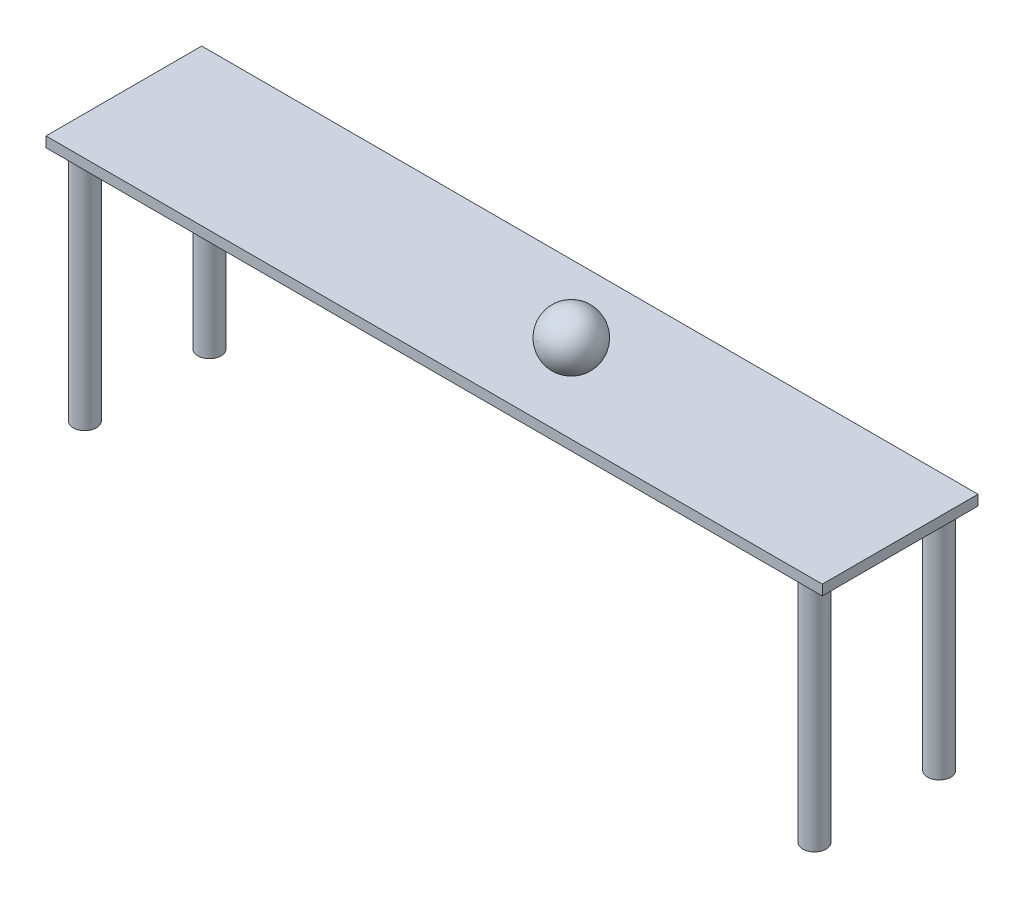
ISO-10303-21;
HEADER;
FILE_DESCRIPTION(('STEP AP214'),'2;1');
FILE_NAME('part.step','',(''),(''),'','','');
FILE_SCHEMA(('AUTOMOTIVE_DESIGN { 1 0 10303 214 1 1 1 1 }'));
ENDSEC;
DATA;
#1=APPLICATION_CONTEXT('core data for automotive mechanical design processes');
#2=APPLICATION_PROTOCOL_DEFINITION('international standard','automotive_design',2000,#1);
#3=PRODUCT_CONTEXT('',#1,'mechanical');
#4=PRODUCT('Part','Part','',(#3));
#5=PRODUCT_RELATED_PRODUCT_CATEGORY('part','',(#4));
#6=PRODUCT_DEFINITION_FORMATION('','',#4);
#7=PRODUCT_DEFINITION_CONTEXT('part definition',#1,'design');
#8=PRODUCT_DEFINITION('design','',#6,#7);
#9=PRODUCT_DEFINITION_SHAPE('','',#8);
#10=(LENGTH_UNIT() NAMED_UNIT(*) SI_UNIT(.MILLI.,.METRE.));
#11=(NAMED_UNIT(*) PLANE_ANGLE_UNIT() SI_UNIT($,.RADIAN.));
#12=(NAMED_UNIT(*) SI_UNIT($,.STERADIAN.) SOLID_ANGLE_UNIT());
#13=UNCERTAINTY_MEASURE_WITH_UNIT(LENGTH_MEASURE(1.E-05),#10,'distance_accuracy_value','');
#14=(GEOMETRIC_REPRESENTATION_CONTEXT(3) GLOBAL_UNCERTAINTY_ASSIGNED_CONTEXT((#13)) GLOBAL_UNIT_ASSIGNED_CONTEXT((#10,
#11,#12)) REPRESENTATION_CONTEXT('',''));
#15=CARTESIAN_POINT('',(0.,0.,0.));
#16=DIRECTION('',(0.,0.,1.));
#17=DIRECTION('',(1.,0.,0.));
#18=AXIS2_PLACEMENT_3D('',#15,#16,#17);
#19=CARTESIAN_POINT('',(100.,497.681146786366,176.992255331555));
#20=DIRECTION('',(0.,1.,0.));
#21=DIRECTION('',(0.,0.,1.));
#22=AXIS2_PLACEMENT_3D('',#19,#20,#21);
#23=SPHERICAL_SURFACE('',#22,35.);
#24=CARTESIAN_POINT('',(100.,532.681146786366,176.992255331555));
#25=VERTEX_POINT('',#24);
#26=VERTEX_LOOP('',#25);
#27=FACE_BOUND('',#26,.T.);
#28=ADVANCED_FACE('F37',(#27),#23,.T.);
#29=CLOSED_SHELL('',(#28));
#30=MANIFOLD_SOLID_BREP('B2',#29);
#31=CARTESIAN_POINT('',(500.,447.99621716114,253.640443622216));
#32=DIRECTION('',(0.,1.,0.));
#33=DIRECTION('',(0.,0.,1.));
#34=AXIS2_PLACEMENT_3D('',#31,#32,#33);
#35=PLANE('',#34);
#36=CARTESIAN_POINT('',(470.,447.99621716114,73.0579335827263));
#37=DIRECTION('',(0.,1.,0.));
#38=DIRECTION('',(0.,0.,1.));
#39=AXIS2_PLACEMENT_3D('',#36,#37,#38);
#40=CIRCLE('',#39,15.);
#41=CARTESIAN_POINT('',(470.,447.99621716114,88.0579335827264));
#42=VERTEX_POINT('',#41);
#43=EDGE_CURVE('E58',#42,#42,#40,.F.);
#44=ORIENTED_EDGE('',*,*,#43,.F.);
#45=EDGE_LOOP('',(#44));
#46=FACE_BOUND('',#45,.T.);
#47=CARTESIAN_POINT('',(-470.,447.99621716114,233.640443622216));
#48=DIRECTION('',(0.,1.,0.));
#49=DIRECTION('',(0.,0.,1.));
#50=AXIS2_PLACEMENT_3D('',#47,#48,#49);
#51=CIRCLE('',#50,15.);
#52=CARTESIAN_POINT('',(-470.,447.99621716114,248.640443622216));
#53=VERTEX_POINT('',#52);
#54=EDGE_CURVE('E108',#53,#53,#51,.F.);
#55=ORIENTED_EDGE('',*,*,#54,.F.);
#56=EDGE_LOOP('',(#55));
#57=FACE_BOUND('',#56,.T.);
#58=DIRECTION('',(0.,0.,-1.));
#59=VECTOR('',#58,1.);
#60=CARTESIAN_POINT('',(-500.,447.99621716114,253.640443622216));
#61=LINE('',#60,#59);
#62=CARTESIAN_POINT('',(-500.,447.99621716114,253.640443622216));
#63=VERTEX_POINT('',#62);
#64=CARTESIAN_POINT('',(-500.,447.99621716114,53.0579335827263));
#65=VERTEX_POINT('',#64);
#66=EDGE_CURVE('E91',#63,#65,#61,.T.);
#67=ORIENTED_EDGE('',*,*,#66,.T.);
#68=DIRECTION('',(-1.,0.,0.));
#69=VECTOR('',#68,1.);
#70=CARTESIAN_POINT('',(500.,447.99621716114,53.0579335827263));
#71=LINE('',#70,#69);
#72=CARTESIAN_POINT('',(500.,447.99621716114,53.0579335827263));
#73=VERTEX_POINT('',#72);
#74=EDGE_CURVE('E109',#73,#65,#71,.T.);
#75=ORIENTED_EDGE('',*,*,#74,.F.);
#76=DIRECTION('',(0.,0.,-1.));
#77=VECTOR('',#76,1.);
#78=CARTESIAN_POINT('',(500.,447.99621716114,253.640443622216));
#79=LINE('',#78,#77);
#80=CARTESIAN_POINT('',(500.,447.99621716114,253.640443622216));
#81=VERTEX_POINT('',#80);
#82=EDGE_CURVE('E105',#81,#73,#79,.T.);
#83=ORIENTED_EDGE('',*,*,#82,.F.);
#84=DIRECTION('',(-1.,0.,0.));
#85=VECTOR('',#84,1.);
#86=CARTESIAN_POINT('',(500.,447.99621716114,253.640443622216));
#87=LINE('',#86,#85);
#88=EDGE_CURVE('E103',#81,#63,#87,.T.);
#89=ORIENTED_EDGE('',*,*,#88,.T.);
#90=EDGE_LOOP('',(#67,#75,#83,#89));
#91=FACE_BOUND('',#90,.T.);
#92=CARTESIAN_POINT('',(-470.,447.99621716114,73.0579335827263));
#93=DIRECTION('',(0.,1.,0.));
#94=DIRECTION('',(0.,0.,1.));
#95=AXIS2_PLACEMENT_3D('',#92,#93,#94);
#96=CIRCLE('',#95,15.);
#97=CARTESIAN_POINT('',(-470.,447.99621716114,88.0579335827264));
#98=VERTEX_POINT('',#97);
#99=EDGE_CURVE('E135',#98,#98,#96,.F.);
#100=ORIENTED_EDGE('',*,*,#99,.F.);
#101=EDGE_LOOP('',(#100));
#102=FACE_BOUND('',#101,.T.);
#103=CARTESIAN_POINT('',(470.,447.99621716114,233.640443622216));
#104=DIRECTION('',(0.,1.,0.));
#105=DIRECTION('',(0.,0.,1.));
#106=AXIS2_PLACEMENT_3D('',#103,#104,#105);
#107=CIRCLE('',#106,15.);
#108=CARTESIAN_POINT('',(470.,447.99621716114,248.640443622216));
#109=VERTEX_POINT('',#108);
#110=EDGE_CURVE('E35',#109,#109,#107,.F.);
#111=ORIENTED_EDGE('',*,*,#110,.F.);
#112=EDGE_LOOP('',(#111));
#113=FACE_BOUND('',#112,.T.);
#114=ADVANCED_FACE('F50',(#46,#57,#91,#102,#113),#35,.F.);
#115=CARTESIAN_POINT('',(500.,461.204560088703,253.640443622216));
#116=DIRECTION('',(0.,0.,-1.));
#117=DIRECTION('',(-1.,0.,0.));
#118=AXIS2_PLACEMENT_3D('',#115,#116,#117);
#119=PLANE('',#118);
#120=DIRECTION('',(0.,-1.,0.));
#121=VECTOR('',#120,1.);
#122=CARTESIAN_POINT('',(-500.,461.204560088703,253.640443622216));
#123=LINE('',#122,#121);
#124=CARTESIAN_POINT('',(-500.,461.204560088703,253.640443622216));
#125=VERTEX_POINT('',#124);
#126=EDGE_CURVE('E96',#125,#63,#123,.T.);
#127=ORIENTED_EDGE('',*,*,#126,.T.);
#128=ORIENTED_EDGE('',*,*,#88,.F.);
#129=DIRECTION('',(0.,-1.,0.));
#130=VECTOR('',#129,1.);
#131=CARTESIAN_POINT('',(500.,461.204560088703,253.640443622216));
#132=LINE('',#131,#130);
#133=CARTESIAN_POINT('',(500.,461.204560088703,253.640443622216));
#134=VERTEX_POINT('',#133);
#135=EDGE_CURVE('E123',#134,#81,#132,.T.);
#136=ORIENTED_EDGE('',*,*,#135,.F.);
#137=DIRECTION('',(-1.,0.,0.));
#138=VECTOR('',#137,1.);
#139=CARTESIAN_POINT('',(500.,461.204560088703,253.640443622216));
#140=LINE('',#139,#138);
#141=EDGE_CURVE('E112',#134,#125,#140,.T.);
#142=ORIENTED_EDGE('',*,*,#141,.T.);
#143=EDGE_LOOP('',(#127,#128,#136,#142));
#144=FACE_BOUND('',#143,.T.);
#145=ADVANCED_FACE('F52',(#144),#119,.F.);
#146=CARTESIAN_POINT('',(500.,461.204560088703,53.0579335827263));
#147=DIRECTION('',(0.,0.,1.));
#148=DIRECTION('',(1.,0.,0.));
#149=AXIS2_PLACEMENT_3D('',#146,#147,#148);
#150=PLANE('',#149);
#151=DIRECTION('',(0.,1.,0.));
#152=VECTOR('',#151,1.);
#153=CARTESIAN_POINT('',(-500.,461.204560088703,53.0579335827263));
#154=LINE('',#153,#152);
#155=CARTESIAN_POINT('',(-500.,461.204560088703,53.0579335827263));
#156=VERTEX_POINT('',#155);
#157=EDGE_CURVE('E97',#65,#156,#154,.T.);
#158=ORIENTED_EDGE('',*,*,#157,.T.);
#159=DIRECTION('',(-1.,0.,0.));
#160=VECTOR('',#159,1.);
#161=CARTESIAN_POINT('',(500.,461.204560088703,53.0579335827263));
#162=LINE('',#161,#160);
#163=CARTESIAN_POINT('',(500.,461.204560088703,53.0579335827263));
#164=VERTEX_POINT('',#163);
#165=EDGE_CURVE('E129',#164,#156,#162,.T.);
#166=ORIENTED_EDGE('',*,*,#165,.F.);
#167=DIRECTION('',(0.,1.,0.));
#168=VECTOR('',#167,1.);
#169=CARTESIAN_POINT('',(500.,461.204560088703,53.0579335827263));
#170=LINE('',#169,#168);
#171=EDGE_CURVE('E70',#73,#164,#170,.T.);
#172=ORIENTED_EDGE('',*,*,#171,.F.);
#173=ORIENTED_EDGE('',*,*,#74,.T.);
#174=EDGE_LOOP('',(#158,#166,#172,#173));
#175=FACE_BOUND('',#174,.T.);
#176=ADVANCED_FACE('F168',(#175),#150,.F.);
#177=CARTESIAN_POINT('',(500.,461.204560088703,253.640443622216));
#178=DIRECTION('',(0.,-1.,0.));
#179=DIRECTION('',(0.,0.,-1.));
#180=AXIS2_PLACEMENT_3D('',#177,#178,#179);
#181=PLANE('',#180);
#182=DIRECTION('',(0.,0.,1.));
#183=VECTOR('',#182,1.);
#184=CARTESIAN_POINT('',(-500.,461.204560088703,253.640443622216));
#185=LINE('',#184,#183);
#186=EDGE_CURVE('E121',#156,#125,#185,.T.);
#187=ORIENTED_EDGE('',*,*,#186,.T.);
#188=ORIENTED_EDGE('',*,*,#141,.F.);
#189=DIRECTION('',(0.,0.,1.));
#190=VECTOR('',#189,1.);
#191=CARTESIAN_POINT('',(500.,461.204560088703,253.640443622216));
#192=LINE('',#191,#190);
#193=EDGE_CURVE('E65',#164,#134,#192,.T.);
#194=ORIENTED_EDGE('',*,*,#193,.F.);
#195=ORIENTED_EDGE('',*,*,#165,.T.);
#196=EDGE_LOOP('',(#187,#188,#194,#195));
#197=FACE_BOUND('',#196,.T.);
#198=ADVANCED_FACE('F165',(#197),#181,.F.);
#199=CARTESIAN_POINT('',(500.,447.99621716114,253.640443622216));
#200=DIRECTION('',(1.,0.,0.));
#201=DIRECTION('',(0.,0.,-1.));
#202=AXIS2_PLACEMENT_3D('',#199,#200,#201);
#203=PLANE('',#202);
#204=ORIENTED_EDGE('',*,*,#135,.T.);
#205=ORIENTED_EDGE('',*,*,#82,.T.);
#206=ORIENTED_EDGE('',*,*,#171,.T.);
#207=ORIENTED_EDGE('',*,*,#193,.T.);
#208=EDGE_LOOP('',(#204,#205,#206,#207));
#209=FACE_BOUND('',#208,.T.);
#210=ADVANCED_FACE('F158',(#209),#203,.T.);
#211=CARTESIAN_POINT('',(-500.,447.99621716114,253.640443622216));
#212=DIRECTION('',(1.,0.,0.));
#213=DIRECTION('',(0.,0.,-1.));
#214=AXIS2_PLACEMENT_3D('',#211,#212,#213);
#215=PLANE('',#214);
#216=ORIENTED_EDGE('',*,*,#126,.F.);
#217=ORIENTED_EDGE('',*,*,#186,.F.);
#218=ORIENTED_EDGE('',*,*,#157,.F.);
#219=ORIENTED_EDGE('',*,*,#66,.F.);
#220=EDGE_LOOP('',(#216,#217,#218,#219));
#221=FACE_BOUND('',#220,.T.);
#222=ADVANCED_FACE('F93',(#221),#215,.F.);
#223=CARTESIAN_POINT('',(-470.,147.99621716114,233.640443622216));
#224=DIRECTION('',(0.,1.,0.));
#225=DIRECTION('',(0.,0.,1.));
#226=AXIS2_PLACEMENT_3D('',#223,#224,#225);
#227=CYLINDRICAL_SURFACE('',#226,15.);
#228=CARTESIAN_POINT('',(-470.,147.99621716114,233.640443622216));
#229=DIRECTION('',(0.,-1.,0.));
#230=DIRECTION('',(0.,0.,-1.));
#231=AXIS2_PLACEMENT_3D('',#228,#229,#230);
#232=CIRCLE('',#231,15.);
#233=CARTESIAN_POINT('',(-470.,147.99621716114,218.640443622216));
#234=VERTEX_POINT('',#233);
#235=EDGE_CURVE('E113',#234,#234,#232,.T.);
#236=ORIENTED_EDGE('',*,*,#235,.F.);
#237=EDGE_LOOP('',(#236));
#238=FACE_BOUND('',#237,.T.);
#239=ORIENTED_EDGE('',*,*,#54,.T.);
#240=EDGE_LOOP('',(#239));
#241=FACE_BOUND('',#240,.T.);
#242=ADVANCED_FACE('F146',(#238,#241),#227,.T.);
#243=CARTESIAN_POINT('',(-470.,147.99621716114,233.640443622216));
#244=DIRECTION('',(0.,-1.,0.));
#245=DIRECTION('',(0.,0.,-1.));
#246=AXIS2_PLACEMENT_3D('',#243,#244,#245);
#247=PLANE('',#246);
#248=ORIENTED_EDGE('',*,*,#235,.T.);
#249=EDGE_LOOP('',(#248));
#250=FACE_BOUND('',#249,.T.);
#251=ADVANCED_FACE('F148',(#250),#247,.T.);
#252=CARTESIAN_POINT('',(-470.,147.99621716114,73.0579335827263));
#253=DIRECTION('',(0.,1.,0.));
#254=DIRECTION('',(0.,0.,1.));
#255=AXIS2_PLACEMENT_3D('',#252,#253,#254);
#256=CYLINDRICAL_SURFACE('',#255,15.);
#257=CARTESIAN_POINT('',(-470.,147.99621716114,73.0579335827263));
#258=DIRECTION('',(0.,-1.,0.));
#259=DIRECTION('',(0.,0.,-1.));
#260=AXIS2_PLACEMENT_3D('',#257,#258,#259);
#261=CIRCLE('',#260,15.);
#262=CARTESIAN_POINT('',(-470.,147.99621716114,58.0579335827263));
#263=VERTEX_POINT('',#262);
#264=EDGE_CURVE('E116',#263,#263,#261,.T.);
#265=ORIENTED_EDGE('',*,*,#264,.F.);
#266=EDGE_LOOP('',(#265));
#267=FACE_BOUND('',#266,.T.);
#268=ORIENTED_EDGE('',*,*,#99,.T.);
#269=EDGE_LOOP('',(#268));
#270=FACE_BOUND('',#269,.T.);
#271=ADVANCED_FACE('F155',(#267,#270),#256,.T.);
#272=CARTESIAN_POINT('',(-470.,147.99621716114,73.0579335827263));
#273=DIRECTION('',(0.,-1.,0.));
#274=DIRECTION('',(0.,0.,-1.));
#275=AXIS2_PLACEMENT_3D('',#272,#273,#274);
#276=PLANE('',#275);
#277=ORIENTED_EDGE('',*,*,#264,.T.);
#278=EDGE_LOOP('',(#277));
#279=FACE_BOUND('',#278,.T.);
#280=ADVANCED_FACE('F204',(#279),#276,.T.);
#281=CARTESIAN_POINT('',(470.,147.99621716114,73.0579335827263));
#282=DIRECTION('',(0.,1.,0.));
#283=DIRECTION('',(0.,0.,1.));
#284=AXIS2_PLACEMENT_3D('',#281,#282,#283);
#285=CYLINDRICAL_SURFACE('',#284,15.);
#286=CARTESIAN_POINT('',(470.,147.99621716114,73.0579335827263));
#287=DIRECTION('',(0.,-1.,0.));
#288=DIRECTION('',(0.,0.,-1.));
#289=AXIS2_PLACEMENT_3D('',#286,#287,#288);
#290=CIRCLE('',#289,15.);
#291=CARTESIAN_POINT('',(470.,147.99621716114,58.0579335827263));
#292=VERTEX_POINT('',#291);
#293=EDGE_CURVE('E259',#292,#292,#290,.T.);
#294=ORIENTED_EDGE('',*,*,#293,.F.);
#295=EDGE_LOOP('',(#294));
#296=FACE_BOUND('',#295,.T.);
#297=ORIENTED_EDGE('',*,*,#43,.T.);
#298=EDGE_LOOP('',(#297));
#299=FACE_BOUND('',#298,.T.);
#300=ADVANCED_FACE('F140',(#296,#299),#285,.T.);
#301=CARTESIAN_POINT('',(470.,147.99621716114,73.0579335827263));
#302=DIRECTION('',(0.,-1.,0.));
#303=DIRECTION('',(0.,0.,-1.));
#304=AXIS2_PLACEMENT_3D('',#301,#302,#303);
#305=PLANE('',#304);
#306=ORIENTED_EDGE('',*,*,#293,.T.);
#307=EDGE_LOOP('',(#306));
#308=FACE_BOUND('',#307,.T.);
#309=ADVANCED_FACE('F222',(#308),#305,.T.);
#310=CARTESIAN_POINT('',(470.,147.99621716114,233.640443622216));
#311=DIRECTION('',(0.,1.,0.));
#312=DIRECTION('',(0.,0.,1.));
#313=AXIS2_PLACEMENT_3D('',#310,#311,#312);
#314=CYLINDRICAL_SURFACE('',#313,15.);
#315=CARTESIAN_POINT('',(470.,147.99621716114,233.640443622216));
#316=DIRECTION('',(0.,-1.,0.));
#317=DIRECTION('',(0.,0.,-1.));
#318=AXIS2_PLACEMENT_3D('',#315,#316,#317);
#319=CIRCLE('',#318,15.);
#320=CARTESIAN_POINT('',(470.,147.99621716114,218.640443622216));
#321=VERTEX_POINT('',#320);
#322=EDGE_CURVE('E258',#321,#321,#319,.T.);
#323=ORIENTED_EDGE('',*,*,#322,.F.);
#324=EDGE_LOOP('',(#323));
#325=FACE_BOUND('',#324,.T.);
#326=ORIENTED_EDGE('',*,*,#110,.T.);
#327=EDGE_LOOP('',(#326));
#328=FACE_BOUND('',#327,.T.);
#329=ADVANCED_FACE('F232',(#325,#328),#314,.T.);
#330=CARTESIAN_POINT('',(470.,147.99621716114,233.640443622216));
#331=DIRECTION('',(0.,-1.,0.));
#332=DIRECTION('',(0.,0.,-1.));
#333=AXIS2_PLACEMENT_3D('',#330,#331,#332);
#334=PLANE('',#333);
#335=ORIENTED_EDGE('',*,*,#322,.T.);
#336=EDGE_LOOP('',(#335));
#337=FACE_BOUND('',#336,.T.);
#338=ADVANCED_FACE('F242',(#337),#334,.T.);
#339=CLOSED_SHELL('',(#114,#145,#176,#198,#210,#222,#242,#251,#271,#280,#300,#309,#329,#338));
#340=MANIFOLD_SOLID_BREP('B6',#339);
#341=ADVANCED_BREP_SHAPE_REPRESENTATION('',(#18,#30,#340),#14);
#342=SHAPE_DEFINITION_REPRESENTATION(#9,#341);
ENDSEC;
END-ISO-10303-21;
